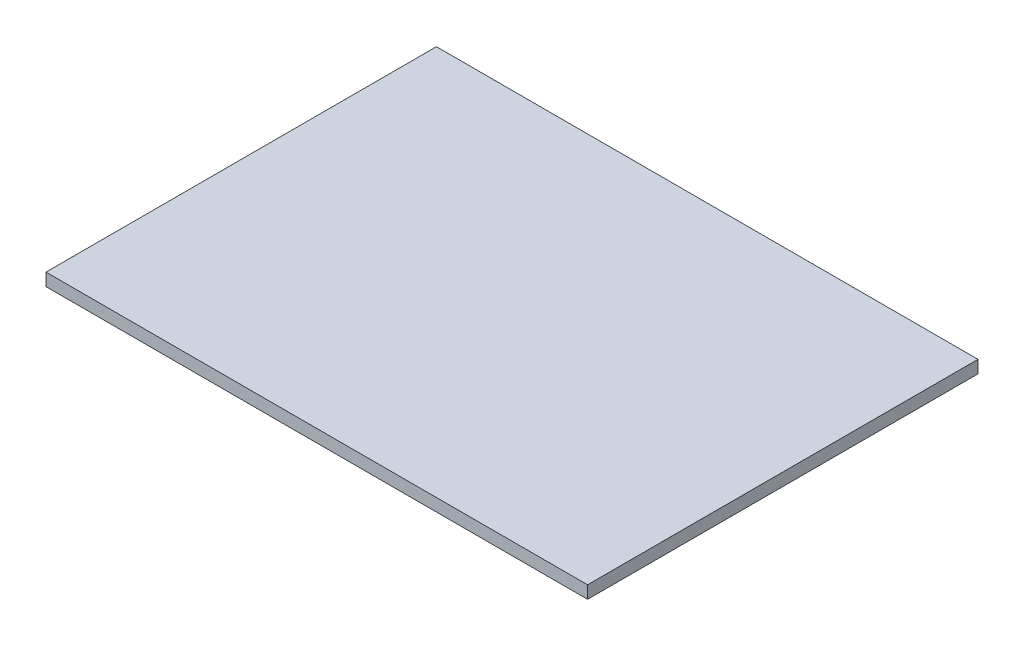
ISO-10303-21;
HEADER;
FILE_DESCRIPTION(('STEP AP214'),'2;1');
FILE_NAME('part.step','',(''),(''),'','','');
FILE_SCHEMA(('AUTOMOTIVE_DESIGN { 1 0 10303 214 1 1 1 1 }'));
ENDSEC;
DATA;
#1=APPLICATION_CONTEXT('core data for automotive mechanical design processes');
#2=APPLICATION_PROTOCOL_DEFINITION('international standard','automotive_design',2000,#1);
#3=PRODUCT_CONTEXT('',#1,'mechanical');
#4=PRODUCT('Part','Part','',(#3));
#5=PRODUCT_RELATED_PRODUCT_CATEGORY('part','',(#4));
#6=PRODUCT_DEFINITION_FORMATION('','',#4);
#7=PRODUCT_DEFINITION_CONTEXT('part definition',#1,'design');
#8=PRODUCT_DEFINITION('design','',#6,#7);
#9=PRODUCT_DEFINITION_SHAPE('','',#8);
#10=(LENGTH_UNIT() NAMED_UNIT(*) SI_UNIT(.MILLI.,.METRE.));
#11=(NAMED_UNIT(*) PLANE_ANGLE_UNIT() SI_UNIT($,.RADIAN.));
#12=(NAMED_UNIT(*) SI_UNIT($,.STERADIAN.) SOLID_ANGLE_UNIT());
#13=UNCERTAINTY_MEASURE_WITH_UNIT(LENGTH_MEASURE(1.E-05),#10,'distance_accuracy_value','');
#14=(GEOMETRIC_REPRESENTATION_CONTEXT(3) GLOBAL_UNCERTAINTY_ASSIGNED_CONTEXT((#13)) GLOBAL_UNIT_ASSIGNED_CONTEXT((#10,
#11,#12)) REPRESENTATION_CONTEXT('',''));
#15=CARTESIAN_POINT('',(0.,0.,0.));
#16=DIRECTION('',(0.,0.,1.));
#17=DIRECTION('',(1.,0.,0.));
#18=AXIS2_PLACEMENT_3D('',#15,#16,#17);
#19=CARTESIAN_POINT('',(107.5,5.,77.5));
#20=DIRECTION('',(-1.,0.,0.));
#21=DIRECTION('',(0.,0.,1.));
#22=AXIS2_PLACEMENT_3D('',#19,#20,#21);
#23=PLANE('',#22);
#24=DIRECTION('',(0.,0.,-1.));
#25=VECTOR('',#24,1.);
#26=CARTESIAN_POINT('',(107.5,0.,77.5));
#27=LINE('',#26,#25);
#28=CARTESIAN_POINT('',(107.5,0.,77.5));
#29=VERTEX_POINT('',#28);
#30=CARTESIAN_POINT('',(107.5,0.,-77.5));
#31=VERTEX_POINT('',#30);
#32=EDGE_CURVE('E96',#29,#31,#27,.T.);
#33=ORIENTED_EDGE('',*,*,#32,.T.);
#34=DIRECTION('',(0.,-1.,0.));
#35=VECTOR('',#34,1.);
#36=CARTESIAN_POINT('',(107.5,5.,-77.5));
#37=LINE('',#36,#35);
#38=CARTESIAN_POINT('',(107.5,5.,-77.5));
#39=VERTEX_POINT('',#38);
#40=EDGE_CURVE('E11',#39,#31,#37,.T.);
#41=ORIENTED_EDGE('',*,*,#40,.F.);
#42=DIRECTION('',(0.,0.,-1.));
#43=VECTOR('',#42,1.);
#44=CARTESIAN_POINT('',(107.5,5.,77.5));
#45=LINE('',#44,#43);
#46=CARTESIAN_POINT('',(107.5,5.,77.5));
#47=VERTEX_POINT('',#46);
#48=EDGE_CURVE('E84',#47,#39,#45,.T.);
#49=ORIENTED_EDGE('',*,*,#48,.F.);
#50=DIRECTION('',(0.,-1.,0.));
#51=VECTOR('',#50,1.);
#52=CARTESIAN_POINT('',(107.5,5.,77.5));
#53=LINE('',#52,#51);
#54=EDGE_CURVE('E92',#47,#29,#53,.T.);
#55=ORIENTED_EDGE('',*,*,#54,.T.);
#56=EDGE_LOOP('',(#33,#41,#49,#55));
#57=FACE_BOUND('',#56,.T.);
#58=ADVANCED_FACE('F33',(#57),#23,.F.);
#59=CARTESIAN_POINT('',(-107.5,5.,-77.5));
#60=DIRECTION('',(0.,0.,1.));
#61=DIRECTION('',(1.,0.,0.));
#62=AXIS2_PLACEMENT_3D('',#59,#60,#61);
#63=PLANE('',#62);
#64=DIRECTION('',(-1.,0.,0.));
#65=VECTOR('',#64,1.);
#66=CARTESIAN_POINT('',(-107.5,0.,-77.5));
#67=LINE('',#66,#65);
#68=CARTESIAN_POINT('',(-107.5,0.,-77.5));
#69=VERTEX_POINT('',#68);
#70=EDGE_CURVE('E88',#31,#69,#67,.T.);
#71=ORIENTED_EDGE('',*,*,#70,.T.);
#72=DIRECTION('',(0.,-1.,0.));
#73=VECTOR('',#72,1.);
#74=CARTESIAN_POINT('',(-107.5,5.,-77.5));
#75=LINE('',#74,#73);
#76=CARTESIAN_POINT('',(-107.5,5.,-77.5));
#77=VERTEX_POINT('',#76);
#78=EDGE_CURVE('E41',#77,#69,#75,.T.);
#79=ORIENTED_EDGE('',*,*,#78,.F.);
#80=DIRECTION('',(-1.,0.,0.));
#81=VECTOR('',#80,1.);
#82=CARTESIAN_POINT('',(-107.5,5.,-77.5));
#83=LINE('',#82,#81);
#84=EDGE_CURVE('E79',#39,#77,#83,.T.);
#85=ORIENTED_EDGE('',*,*,#84,.F.);
#86=ORIENTED_EDGE('',*,*,#40,.T.);
#87=EDGE_LOOP('',(#71,#79,#85,#86));
#88=FACE_BOUND('',#87,.T.);
#89=ADVANCED_FACE('F87',(#88),#63,.F.);
#90=CARTESIAN_POINT('',(-107.5,5.,77.5));
#91=DIRECTION('',(1.,0.,0.));
#92=DIRECTION('',(0.,0.,-1.));
#93=AXIS2_PLACEMENT_3D('',#90,#91,#92);
#94=PLANE('',#93);
#95=DIRECTION('',(0.,0.,1.));
#96=VECTOR('',#95,1.);
#97=CARTESIAN_POINT('',(-107.5,0.,77.5));
#98=LINE('',#97,#96);
#99=CARTESIAN_POINT('',(-107.5,0.,77.5));
#100=VERTEX_POINT('',#99);
#101=EDGE_CURVE('E66',#69,#100,#98,.T.);
#102=ORIENTED_EDGE('',*,*,#101,.T.);
#103=DIRECTION('',(0.,-1.,0.));
#104=VECTOR('',#103,1.);
#105=CARTESIAN_POINT('',(-107.5,5.,77.5));
#106=LINE('',#105,#104);
#107=CARTESIAN_POINT('',(-107.5,5.,77.5));
#108=VERTEX_POINT('',#107);
#109=EDGE_CURVE('E89',#108,#100,#106,.T.);
#110=ORIENTED_EDGE('',*,*,#109,.F.);
#111=DIRECTION('',(0.,0.,1.));
#112=VECTOR('',#111,1.);
#113=CARTESIAN_POINT('',(-107.5,5.,77.5));
#114=LINE('',#113,#112);
#115=EDGE_CURVE('E82',#77,#108,#114,.T.);
#116=ORIENTED_EDGE('',*,*,#115,.F.);
#117=ORIENTED_EDGE('',*,*,#78,.T.);
#118=EDGE_LOOP('',(#102,#110,#116,#117));
#119=FACE_BOUND('',#118,.T.);
#120=ADVANCED_FACE('F90',(#119),#94,.F.);
#121=CARTESIAN_POINT('',(-107.5,5.,77.5));
#122=DIRECTION('',(0.,0.,-1.));
#123=DIRECTION('',(-1.,0.,0.));
#124=AXIS2_PLACEMENT_3D('',#121,#122,#123);
#125=PLANE('',#124);
#126=DIRECTION('',(1.,0.,0.));
#127=VECTOR('',#126,1.);
#128=CARTESIAN_POINT('',(-107.5,0.,77.5));
#129=LINE('',#128,#127);
#130=EDGE_CURVE('E72',#100,#29,#129,.T.);
#131=ORIENTED_EDGE('',*,*,#130,.T.);
#132=ORIENTED_EDGE('',*,*,#54,.F.);
#133=DIRECTION('',(1.,0.,0.));
#134=VECTOR('',#133,1.);
#135=CARTESIAN_POINT('',(-107.5,5.,77.5));
#136=LINE('',#135,#134);
#137=EDGE_CURVE('E49',#108,#47,#136,.T.);
#138=ORIENTED_EDGE('',*,*,#137,.F.);
#139=ORIENTED_EDGE('',*,*,#109,.T.);
#140=EDGE_LOOP('',(#131,#132,#138,#139));
#141=FACE_BOUND('',#140,.T.);
#142=ADVANCED_FACE('F103',(#141),#125,.F.);
#143=CARTESIAN_POINT('',(0.,5.,0.));
#144=DIRECTION('',(0.,-1.,0.));
#145=DIRECTION('',(0.,0.,-1.));
#146=AXIS2_PLACEMENT_3D('',#143,#144,#145);
#147=PLANE('',#146);
#148=ORIENTED_EDGE('',*,*,#48,.T.);
#149=ORIENTED_EDGE('',*,*,#84,.T.);
#150=ORIENTED_EDGE('',*,*,#115,.T.);
#151=ORIENTED_EDGE('',*,*,#137,.T.);
#152=EDGE_LOOP('',(#148,#149,#150,#151));
#153=FACE_BOUND('',#152,.T.);
#154=ADVANCED_FACE('F80',(#153),#147,.F.);
#155=CARTESIAN_POINT('',(0.,0.,0.));
#156=DIRECTION('',(0.,-1.,0.));
#157=DIRECTION('',(0.,0.,-1.));
#158=AXIS2_PLACEMENT_3D('',#155,#156,#157);
#159=PLANE('',#158);
#160=ORIENTED_EDGE('',*,*,#32,.F.);
#161=ORIENTED_EDGE('',*,*,#130,.F.);
#162=ORIENTED_EDGE('',*,*,#101,.F.);
#163=ORIENTED_EDGE('',*,*,#70,.F.);
#164=EDGE_LOOP('',(#160,#161,#162,#163));
#165=FACE_BOUND('',#164,.T.);
#166=ADVANCED_FACE('F106',(#165),#159,.T.);
#167=CLOSED_SHELL('',(#58,#89,#120,#142,#154,#166));
#168=MANIFOLD_SOLID_BREP('B2',#167);
#169=ADVANCED_BREP_SHAPE_REPRESENTATION('',(#18,#168),#14);
#170=SHAPE_DEFINITION_REPRESENTATION(#9,#169);
ENDSEC;
END-ISO-10303-21;
